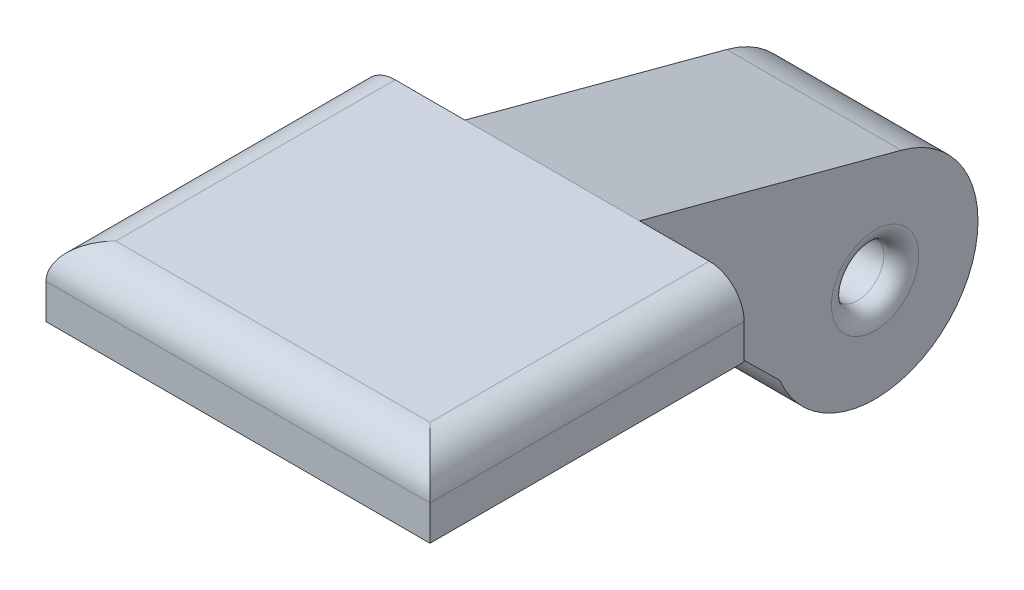
ISO-10303-21;
HEADER;
FILE_DESCRIPTION(('STEP AP214'),'2;1');
FILE_NAME('part.step','',(''),(''),'','','');
FILE_SCHEMA(('AUTOMOTIVE_DESIGN { 1 0 10303 214 1 1 1 1 }'));
ENDSEC;
DATA;
#1=APPLICATION_CONTEXT('core data for automotive mechanical design processes');
#2=APPLICATION_PROTOCOL_DEFINITION('international standard','automotive_design',2000,#1);
#3=PRODUCT_CONTEXT('',#1,'mechanical');
#4=PRODUCT('Part','Part','',(#3));
#5=PRODUCT_RELATED_PRODUCT_CATEGORY('part','',(#4));
#6=PRODUCT_DEFINITION_FORMATION('','',#4);
#7=PRODUCT_DEFINITION_CONTEXT('part definition',#1,'design');
#8=PRODUCT_DEFINITION('design','',#6,#7);
#9=PRODUCT_DEFINITION_SHAPE('','',#8);
#10=(LENGTH_UNIT() NAMED_UNIT(*) SI_UNIT(.MILLI.,.METRE.));
#11=(NAMED_UNIT(*) PLANE_ANGLE_UNIT() SI_UNIT($,.RADIAN.));
#12=(NAMED_UNIT(*) SI_UNIT($,.STERADIAN.) SOLID_ANGLE_UNIT());
#13=UNCERTAINTY_MEASURE_WITH_UNIT(LENGTH_MEASURE(1.E-05),#10,'distance_accuracy_value','');
#14=(GEOMETRIC_REPRESENTATION_CONTEXT(3) GLOBAL_UNCERTAINTY_ASSIGNED_CONTEXT((#13)) GLOBAL_UNIT_ASSIGNED_CONTEXT((#10,
#11,#12)) REPRESENTATION_CONTEXT('',''));
#15=CARTESIAN_POINT('',(0.,0.,0.));
#16=DIRECTION('',(0.,0.,1.));
#17=DIRECTION('',(1.,0.,0.));
#18=AXIS2_PLACEMENT_3D('',#15,#16,#17);
#19=CARTESIAN_POINT('',(0.,0.,0.));
#20=DIRECTION('',(0.,1.,0.));
#21=DIRECTION('',(0.,0.,1.));
#22=AXIS2_PLACEMENT_3D('',#19,#20,#21);
#23=PLANE('',#22);
#24=DIRECTION('',(-1.,0.,0.));
#25=VECTOR('',#24,1.);
#26=CARTESIAN_POINT('',(-16.4901839134658,0.,-25.5110486759406));
#27=LINE('',#26,#25);
#28=CARTESIAN_POINT('',(-13.2450919567329,0.,-25.5110486759406));
#29=VERTEX_POINT('',#28);
#30=CARTESIAN_POINT('',(-19.2450919567329,0.,-25.5110486759406));
#31=VERTEX_POINT('',#30);
#32=EDGE_CURVE('E163',#29,#31,#27,.T.);
#33=ORIENTED_EDGE('',*,*,#32,.F.);
#34=DIRECTION('',(1.,0.,0.));
#35=VECTOR('',#34,1.);
#36=CARTESIAN_POINT('',(-8.24509195673289,0.,-25.5110486759406));
#37=LINE('',#36,#35);
#38=CARTESIAN_POINT('',(-3.24509195673289,0.,-25.5110486759406));
#39=VERTEX_POINT('',#38);
#40=EDGE_CURVE('E186',#29,#39,#37,.T.);
#41=ORIENTED_EDGE('',*,*,#40,.T.);
#42=DIRECTION('',(1.,0.,0.));
#43=VECTOR('',#42,1.);
#44=CARTESIAN_POINT('',(0.,0.,-25.5110486759406));
#45=LINE('',#44,#43);
#46=CARTESIAN_POINT('',(2.7549080432671,0.,-25.5110486759406));
#47=VERTEX_POINT('',#46);
#48=EDGE_CURVE('E203',#39,#47,#45,.T.);
#49=ORIENTED_EDGE('',*,*,#48,.T.);
#50=DIRECTION('',(0.,0.,1.));
#51=VECTOR('',#50,1.);
#52=CARTESIAN_POINT('',(2.7549080432671,0.,0.));
#53=LINE('',#52,#51);
#54=CARTESIAN_POINT('',(2.7549080432671,0.,-7.51104867594061));
#55=VERTEX_POINT('',#54);
#56=EDGE_CURVE('E189',#47,#55,#53,.T.);
#57=ORIENTED_EDGE('',*,*,#56,.T.);
#58=DIRECTION('',(1.,0.,0.));
#59=VECTOR('',#58,1.);
#60=CARTESIAN_POINT('',(0.,0.,-7.51104867594061));
#61=LINE('',#60,#59);
#62=CARTESIAN_POINT('',(-19.2450919567329,0.,-7.51104867594061));
#63=VERTEX_POINT('',#62);
#64=EDGE_CURVE('E199',#63,#55,#61,.T.);
#65=ORIENTED_EDGE('',*,*,#64,.F.);
#66=DIRECTION('',(0.,0.,1.));
#67=VECTOR('',#66,1.);
#68=CARTESIAN_POINT('',(-19.2450919567329,0.,0.));
#69=LINE('',#68,#67);
#70=EDGE_CURVE('E168',#31,#63,#69,.T.);
#71=ORIENTED_EDGE('',*,*,#70,.F.);
#72=EDGE_LOOP('',(#33,#41,#49,#57,#65,#71));
#73=FACE_BOUND('',#72,.T.);
#74=ADVANCED_FACE('F41',(#73),#23,.F.);
#75=CARTESIAN_POINT('',(2.7549080432671,4.,0.));
#76=DIRECTION('',(1.,0.,0.));
#77=DIRECTION('',(0.,0.,-1.));
#78=AXIS2_PLACEMENT_3D('',#75,#76,#77);
#79=PLANE('',#78);
#80=DIRECTION('',(0.,-1.,0.));
#81=VECTOR('',#80,1.);
#82=CARTESIAN_POINT('',(2.7549080432671,4.,-25.5110486759406));
#83=LINE('',#82,#81);
#84=CARTESIAN_POINT('',(2.7549080432671,2.,-25.5110486759406));
#85=VERTEX_POINT('',#84);
#86=EDGE_CURVE('E216',#85,#47,#83,.T.);
#87=ORIENTED_EDGE('',*,*,#86,.F.);
#88=DIRECTION('',(0.,0.,1.));
#89=VECTOR('',#88,1.);
#90=CARTESIAN_POINT('',(2.7549080432671,2.,0.));
#91=LINE('',#90,#89);
#92=CARTESIAN_POINT('',(2.7549080432671,2.,-7.51104867594061));
#93=VERTEX_POINT('',#92);
#94=EDGE_CURVE('E64',#85,#93,#91,.T.);
#95=ORIENTED_EDGE('',*,*,#94,.T.);
#96=DIRECTION('',(0.,-1.,0.));
#97=VECTOR('',#96,1.);
#98=CARTESIAN_POINT('',(2.7549080432671,4.,-7.51104867594061));
#99=LINE('',#98,#97);
#100=EDGE_CURVE('E198',#93,#55,#99,.T.);
#101=ORIENTED_EDGE('',*,*,#100,.T.);
#102=ORIENTED_EDGE('',*,*,#56,.F.);
#103=EDGE_LOOP('',(#87,#95,#101,#102));
#104=FACE_BOUND('',#103,.T.);
#105=ADVANCED_FACE('F278',(#104),#79,.T.);
#106=CARTESIAN_POINT('',(0.,4.,-25.5110486759406));
#107=DIRECTION('',(0.,0.,-1.));
#108=DIRECTION('',(-1.,0.,0.));
#109=AXIS2_PLACEMENT_3D('',#106,#107,#108);
#110=PLANE('',#109);
#111=DIRECTION('',(1.,0.,0.));
#112=VECTOR('',#111,1.);
#113=CARTESIAN_POINT('',(0.,4.,-25.5110486759406));
#114=LINE('',#113,#112);
#115=CARTESIAN_POINT('',(-3.2450919567329,4.,-25.5110486759406));
#116=VERTEX_POINT('',#115);
#117=CARTESIAN_POINT('',(0.754908043267104,4.,-25.5110486759406));
#118=VERTEX_POINT('',#117);
#119=EDGE_CURVE('E141',#116,#118,#114,.T.);
#120=ORIENTED_EDGE('',*,*,#119,.T.);
#121=CARTESIAN_POINT('',(0.754908043267104,2.,-25.5110486759406));
#122=DIRECTION('',(0.,0.,-1.));
#123=DIRECTION('',(-1.,0.,0.));
#124=AXIS2_PLACEMENT_3D('',#121,#122,#123);
#125=CIRCLE('',#124,2.);
#126=EDGE_CURVE('E57',#118,#85,#125,.T.);
#127=ORIENTED_EDGE('',*,*,#126,.T.);
#128=ORIENTED_EDGE('',*,*,#86,.T.);
#129=ORIENTED_EDGE('',*,*,#48,.F.);
#130=DIRECTION('',(0.,-1.,0.));
#131=VECTOR('',#130,1.);
#132=CARTESIAN_POINT('',(-3.2450919567329,4.,-25.5110486759406));
#133=LINE('',#132,#131);
#134=EDGE_CURVE('E212',#116,#39,#133,.T.);
#135=ORIENTED_EDGE('',*,*,#134,.F.);
#136=EDGE_LOOP('',(#120,#127,#128,#129,#135));
#137=FACE_BOUND('',#136,.T.);
#138=ADVANCED_FACE('F284',(#137),#110,.T.);
#139=CARTESIAN_POINT('',(-3.24509195673289,4.,0.));
#140=DIRECTION('',(-1.,0.,0.));
#141=DIRECTION('',(0.,0.,1.));
#142=AXIS2_PLACEMENT_3D('',#139,#140,#141);
#143=PLANE('',#142);
#144=CARTESIAN_POINT('',(-3.2450919567329,-5.7,-39.0110486759406));
#145=DIRECTION('',(-1.,0.,0.));
#146=DIRECTION('',(0.,0.,1.));
#147=AXIS2_PLACEMENT_3D('',#144,#145,#146);
#148=CIRCLE('',#147,2.5);
#149=CARTESIAN_POINT('',(-3.2450919567329,-5.7,-36.5110486759406));
#150=VERTEX_POINT('',#149);
#151=EDGE_CURVE('E11',#150,#150,#148,.T.);
#152=ORIENTED_EDGE('',*,*,#151,.T.);
#153=EDGE_LOOP('',(#152));
#154=FACE_BOUND('',#153,.T.);
#155=CARTESIAN_POINT('',(-3.24509195673289,-5.7,-39.0110486759406));
#156=DIRECTION('',(1.,0.,0.));
#157=DIRECTION('',(0.,0.,-1.));
#158=AXIS2_PLACEMENT_3D('',#155,#156,#157);
#159=CIRCLE('',#158,5.89704244956011);
#160=CARTESIAN_POINT('',(-3.24509195673289,-7.9402692369487,-33.5561148176894));
#161=VERTEX_POINT('',#160);
#162=CARTESIAN_POINT('',(-3.2450919567329,0.00307896244773687,-40.5110486759406));
#163=VERTEX_POINT('',#162);
#164=EDGE_CURVE('E182',#161,#163,#159,.T.);
#165=ORIENTED_EDGE('',*,*,#164,.T.);
#166=DIRECTION('',(0.,-0.257477470325685,-0.966284301991234));
#167=VECTOR('',#166,1.);
#168=CARTESIAN_POINT('',(-3.2450919567329,0.00307896244773687,-40.5110486759406));
#169=LINE('',#168,#167);
#170=EDGE_CURVE('E131',#116,#163,#169,.T.);
#171=ORIENTED_EDGE('',*,*,#170,.F.);
#172=ORIENTED_EDGE('',*,*,#134,.T.);
#173=DIRECTION('',(0.,-0.702456024630136,-0.711727148183084));
#174=VECTOR('',#173,1.);
#175=CARTESIAN_POINT('',(-3.24509195673289,12.7544279530507,-12.5882858047544));
#176=LINE('',#175,#174);
#177=EDGE_CURVE('E178',#39,#161,#176,.T.);
#178=ORIENTED_EDGE('',*,*,#177,.T.);
#179=EDGE_LOOP('',(#165,#171,#172,#178));
#180=FACE_BOUND('',#179,.T.);
#181=ADVANCED_FACE('F292',(#154,#180),#143,.F.);
#182=CARTESIAN_POINT('',(0.,4.,-7.51104867594061));
#183=DIRECTION('',(0.,0.,-1.));
#184=DIRECTION('',(-1.,0.,0.));
#185=AXIS2_PLACEMENT_3D('',#182,#183,#184);
#186=PLANE('',#185);
#187=ORIENTED_EDGE('',*,*,#100,.F.);
#188=DIRECTION('',(1.,0.,0.));
#189=VECTOR('',#188,1.);
#190=CARTESIAN_POINT('',(-19.2450919567329,2.,-7.51104867594061));
#191=LINE('',#190,#189);
#192=CARTESIAN_POINT('',(-19.2450919567329,2.,-7.51104867594061));
#193=VERTEX_POINT('',#192);
#194=EDGE_CURVE('E233',#93,#193,#191,.F.);
#195=ORIENTED_EDGE('',*,*,#194,.T.);
#196=DIRECTION('',(0.,-1.,0.));
#197=VECTOR('',#196,1.);
#198=CARTESIAN_POINT('',(-19.2450919567329,4.,-7.51104867594061));
#199=LINE('',#198,#197);
#200=EDGE_CURVE('E155',#193,#63,#199,.T.);
#201=ORIENTED_EDGE('',*,*,#200,.T.);
#202=ORIENTED_EDGE('',*,*,#64,.T.);
#203=EDGE_LOOP('',(#187,#195,#201,#202));
#204=FACE_BOUND('',#203,.T.);
#205=ADVANCED_FACE('F289',(#204),#186,.F.);
#206=CARTESIAN_POINT('',(0.,4.,0.));
#207=DIRECTION('',(0.,1.,0.));
#208=DIRECTION('',(0.,0.,1.));
#209=AXIS2_PLACEMENT_3D('',#206,#207,#208);
#210=PLANE('',#209);
#211=DIRECTION('',(-1.,0.,0.));
#212=VECTOR('',#211,1.);
#213=CARTESIAN_POINT('',(-16.4901839134658,4.,-25.5110486759406));
#214=LINE('',#213,#212);
#215=CARTESIAN_POINT('',(-13.2450919567329,4.,-25.5110486759406));
#216=VERTEX_POINT('',#215);
#217=CARTESIAN_POINT('',(-17.2450919567329,4.,-25.5110486759406));
#218=VERTEX_POINT('',#217);
#219=EDGE_CURVE('E139',#216,#218,#214,.T.);
#220=ORIENTED_EDGE('',*,*,#219,.T.);
#221=DIRECTION('',(0.,0.,1.));
#222=VECTOR('',#221,1.);
#223=CARTESIAN_POINT('',(-17.2450919567329,4.,-7.51104867594061));
#224=LINE('',#223,#222);
#225=CARTESIAN_POINT('',(-17.2450919567329,4.,-9.51104867594061));
#226=VERTEX_POINT('',#225);
#227=EDGE_CURVE('E225',#218,#226,#224,.T.);
#228=ORIENTED_EDGE('',*,*,#227,.T.);
#229=DIRECTION('',(1.,0.,0.));
#230=VECTOR('',#229,1.);
#231=CARTESIAN_POINT('',(2.7549080432671,4.,-9.51104867594061));
#232=LINE('',#231,#230);
#233=CARTESIAN_POINT('',(0.754908043267104,4.,-9.51104867594061));
#234=VERTEX_POINT('',#233);
#235=EDGE_CURVE('E222',#226,#234,#232,.T.);
#236=ORIENTED_EDGE('',*,*,#235,.T.);
#237=DIRECTION('',(0.,0.,1.));
#238=VECTOR('',#237,1.);
#239=CARTESIAN_POINT('',(0.754908043267104,4.,0.));
#240=LINE('',#239,#238);
#241=EDGE_CURVE('E219',#234,#118,#240,.F.);
#242=ORIENTED_EDGE('',*,*,#241,.T.);
#243=ORIENTED_EDGE('',*,*,#119,.F.);
#244=DIRECTION('',(1.,0.,0.));
#245=VECTOR('',#244,1.);
#246=CARTESIAN_POINT('',(-13.2450919567329,4.,-25.5110486759406));
#247=LINE('',#246,#245);
#248=EDGE_CURVE('E122',#216,#116,#247,.T.);
#249=ORIENTED_EDGE('',*,*,#248,.F.);
#250=EDGE_LOOP('',(#220,#228,#236,#242,#243,#249));
#251=FACE_BOUND('',#250,.T.);
#252=ADVANCED_FACE('F136',(#251),#210,.T.);
#253=CARTESIAN_POINT('',(-8.24509195673289,-5.7,-39.0110486759406));
#254=DIRECTION('',(1.,0.,0.));
#255=DIRECTION('',(0.,0.,-1.));
#256=AXIS2_PLACEMENT_3D('',#253,#254,#255);
#257=CYLINDRICAL_SURFACE('',#256,5.89704244956011);
#258=ORIENTED_EDGE('',*,*,#164,.F.);
#259=DIRECTION('',(1.,0.,0.));
#260=VECTOR('',#259,1.);
#261=CARTESIAN_POINT('',(-8.24509195673289,-7.9402692369487,-33.5561148176894));
#262=LINE('',#261,#260);
#263=CARTESIAN_POINT('',(-13.2450919567329,-7.9402692369487,-33.5561148176894));
#264=VERTEX_POINT('',#263);
#265=EDGE_CURVE('E190',#264,#161,#262,.T.);
#266=ORIENTED_EDGE('',*,*,#265,.F.);
#267=CARTESIAN_POINT('',(-13.2450919567329,-5.7,-39.0110486759406));
#268=DIRECTION('',(1.,0.,0.));
#269=DIRECTION('',(0.,0.,-1.));
#270=AXIS2_PLACEMENT_3D('',#267,#268,#269);
#271=CIRCLE('',#270,5.89704244956011);
#272=CARTESIAN_POINT('',(-13.2450919567329,0.00307896244773687,-40.5110486759406));
#273=VERTEX_POINT('',#272);
#274=EDGE_CURVE('E143',#264,#273,#271,.T.);
#275=ORIENTED_EDGE('',*,*,#274,.T.);
#276=DIRECTION('',(1.,0.,0.));
#277=VECTOR('',#276,1.);
#278=CARTESIAN_POINT('',(-8.24509195673289,0.00307896244773687,-40.5110486759406));
#279=LINE('',#278,#277);
#280=EDGE_CURVE('E125',#273,#163,#279,.T.);
#281=ORIENTED_EDGE('',*,*,#280,.T.);
#282=EDGE_LOOP('',(#258,#266,#275,#281));
#283=FACE_BOUND('',#282,.T.);
#284=ADVANCED_FACE('F334',(#283),#257,.T.);
#285=CARTESIAN_POINT('',(-8.24509195673289,12.7544279530507,-12.5882858047544));
#286=DIRECTION('',(0.,-0.711727148183084,0.702456024630136));
#287=DIRECTION('',(0.,-0.702456024630136,-0.711727148183084));
#288=AXIS2_PLACEMENT_3D('',#285,#286,#287);
#289=PLANE('',#288);
#290=ORIENTED_EDGE('',*,*,#177,.F.);
#291=ORIENTED_EDGE('',*,*,#40,.F.);
#292=DIRECTION('',(0.,-0.702456024630136,-0.711727148183084));
#293=VECTOR('',#292,1.);
#294=CARTESIAN_POINT('',(-13.2450919567329,12.7544279530507,-12.5882858047544));
#295=LINE('',#294,#293);
#296=EDGE_CURVE('E150',#29,#264,#295,.T.);
#297=ORIENTED_EDGE('',*,*,#296,.T.);
#298=ORIENTED_EDGE('',*,*,#265,.T.);
#299=EDGE_LOOP('',(#290,#291,#297,#298));
#300=FACE_BOUND('',#299,.T.);
#301=ADVANCED_FACE('F332',(#300),#289,.T.);
#302=CARTESIAN_POINT('',(-8.24509195673289,-5.7,-39.0110486759406));
#303=DIRECTION('',(1.,0.,0.));
#304=DIRECTION('',(0.,0.,-1.));
#305=AXIS2_PLACEMENT_3D('',#302,#303,#304);
#306=CYLINDRICAL_SURFACE('',#305,1.5);
#307=CARTESIAN_POINT('',(-12.2450919567329,-5.7,-39.0110486759406));
#308=DIRECTION('',(-1.,0.,0.));
#309=DIRECTION('',(0.,0.,1.));
#310=AXIS2_PLACEMENT_3D('',#307,#308,#309);
#311=CIRCLE('',#310,1.5);
#312=CARTESIAN_POINT('',(-12.2450919567329,-5.7,-37.5110486759406));
#313=VERTEX_POINT('',#312);
#314=EDGE_CURVE('E50',#313,#313,#311,.T.);
#315=ORIENTED_EDGE('',*,*,#314,.T.);
#316=EDGE_LOOP('',(#315));
#317=FACE_BOUND('',#316,.T.);
#318=CARTESIAN_POINT('',(-4.2450919567329,-5.7,-39.0110486759406));
#319=DIRECTION('',(-1.,0.,0.));
#320=DIRECTION('',(0.,0.,1.));
#321=AXIS2_PLACEMENT_3D('',#318,#319,#320);
#322=CIRCLE('',#321,1.5);
#323=CARTESIAN_POINT('',(-4.2450919567329,-5.7,-37.5110486759406));
#324=VERTEX_POINT('',#323);
#325=EDGE_CURVE('E251',#324,#324,#322,.F.);
#326=ORIENTED_EDGE('',*,*,#325,.T.);
#327=EDGE_LOOP('',(#326));
#328=FACE_BOUND('',#327,.T.);
#329=ADVANCED_FACE('F258',(#317,#328),#306,.F.);
#330=CARTESIAN_POINT('',(-19.2450919567329,4.,0.));
#331=DIRECTION('',(1.,0.,0.));
#332=DIRECTION('',(0.,0.,-1.));
#333=AXIS2_PLACEMENT_3D('',#330,#331,#332);
#334=PLANE('',#333);
#335=ORIENTED_EDGE('',*,*,#200,.F.);
#336=DIRECTION('',(0.,0.,1.));
#337=VECTOR('',#336,1.);
#338=CARTESIAN_POINT('',(-19.2450919567329,2.,-25.5110486759406));
#339=LINE('',#338,#337);
#340=CARTESIAN_POINT('',(-19.2450919567329,2.,-25.5110486759406));
#341=VERTEX_POINT('',#340);
#342=EDGE_CURVE('E228',#193,#341,#339,.F.);
#343=ORIENTED_EDGE('',*,*,#342,.T.);
#344=DIRECTION('',(0.,-1.,0.));
#345=VECTOR('',#344,1.);
#346=CARTESIAN_POINT('',(-19.2450919567329,4.,-25.5110486759406));
#347=LINE('',#346,#345);
#348=EDGE_CURVE('E156',#341,#31,#347,.T.);
#349=ORIENTED_EDGE('',*,*,#348,.T.);
#350=ORIENTED_EDGE('',*,*,#70,.T.);
#351=EDGE_LOOP('',(#335,#343,#349,#350));
#352=FACE_BOUND('',#351,.T.);
#353=ADVANCED_FACE('F268',(#352),#334,.F.);
#354=CARTESIAN_POINT('',(-13.2450919567329,4.,0.));
#355=DIRECTION('',(-1.,0.,0.));
#356=DIRECTION('',(0.,0.,1.));
#357=AXIS2_PLACEMENT_3D('',#354,#355,#356);
#358=PLANE('',#357);
#359=CARTESIAN_POINT('',(-13.2450919567329,-5.7,-39.0110486759406));
#360=DIRECTION('',(-1.,0.,0.));
#361=DIRECTION('',(0.,0.,1.));
#362=AXIS2_PLACEMENT_3D('',#359,#360,#361);
#363=CIRCLE('',#362,2.5);
#364=CARTESIAN_POINT('',(-13.2450919567329,-5.7,-36.5110486759406));
#365=VERTEX_POINT('',#364);
#366=EDGE_CURVE('E240',#365,#365,#363,.F.);
#367=ORIENTED_EDGE('',*,*,#366,.T.);
#368=EDGE_LOOP('',(#367));
#369=FACE_BOUND('',#368,.T.);
#370=DIRECTION('',(0.,-0.257477470325685,-0.966284301991234));
#371=VECTOR('',#370,1.);
#372=CARTESIAN_POINT('',(-13.2450919567329,0.00307896244773687,-40.5110486759406));
#373=LINE('',#372,#371);
#374=EDGE_CURVE('E119',#216,#273,#373,.T.);
#375=ORIENTED_EDGE('',*,*,#374,.T.);
#376=ORIENTED_EDGE('',*,*,#274,.F.);
#377=ORIENTED_EDGE('',*,*,#296,.F.);
#378=DIRECTION('',(0.,-1.,0.));
#379=VECTOR('',#378,1.);
#380=CARTESIAN_POINT('',(-13.2450919567329,4.,-25.5110486759406));
#381=LINE('',#380,#379);
#382=EDGE_CURVE('E147',#216,#29,#381,.T.);
#383=ORIENTED_EDGE('',*,*,#382,.F.);
#384=EDGE_LOOP('',(#375,#376,#377,#383));
#385=FACE_BOUND('',#384,.T.);
#386=ADVANCED_FACE('F148',(#369,#385),#358,.T.);
#387=CARTESIAN_POINT('',(-16.4901839134658,4.,-25.5110486759406));
#388=DIRECTION('',(0.,0.,1.));
#389=DIRECTION('',(1.,0.,0.));
#390=AXIS2_PLACEMENT_3D('',#387,#388,#389);
#391=PLANE('',#390);
#392=ORIENTED_EDGE('',*,*,#348,.F.);
#393=CARTESIAN_POINT('',(-17.2450919567329,2.,-25.5110486759406));
#394=DIRECTION('',(0.,0.,1.));
#395=DIRECTION('',(1.,0.,0.));
#396=AXIS2_PLACEMENT_3D('',#393,#394,#395);
#397=CIRCLE('',#396,2.);
#398=EDGE_CURVE('E161',#341,#218,#397,.F.);
#399=ORIENTED_EDGE('',*,*,#398,.T.);
#400=ORIENTED_EDGE('',*,*,#219,.F.);
#401=ORIENTED_EDGE('',*,*,#382,.T.);
#402=ORIENTED_EDGE('',*,*,#32,.T.);
#403=EDGE_LOOP('',(#392,#399,#400,#401,#402));
#404=FACE_BOUND('',#403,.T.);
#405=ADVANCED_FACE('F159',(#404),#391,.F.);
#406=CARTESIAN_POINT('',(-13.2450919567329,0.00307896244773687,-40.5110486759406));
#407=DIRECTION('',(0.,-0.966284301991234,0.257477470325685));
#408=DIRECTION('',(0.,-0.257477470325685,-0.966284301991234));
#409=AXIS2_PLACEMENT_3D('',#406,#407,#408);
#410=PLANE('',#409);
#411=ORIENTED_EDGE('',*,*,#170,.T.);
#412=ORIENTED_EDGE('',*,*,#280,.F.);
#413=ORIENTED_EDGE('',*,*,#374,.F.);
#414=ORIENTED_EDGE('',*,*,#248,.T.);
#415=EDGE_LOOP('',(#411,#412,#413,#414));
#416=FACE_BOUND('',#415,.T.);
#417=ADVANCED_FACE('F121',(#416),#410,.F.);
#418=CARTESIAN_POINT('',(0.754908043267104,2.,0.));
#419=DIRECTION('',(0.,0.,1.));
#420=DIRECTION('',(1.,0.,0.));
#421=AXIS2_PLACEMENT_3D('',#418,#419,#420);
#422=CYLINDRICAL_SURFACE('',#421,2.);
#423=ORIENTED_EDGE('',*,*,#126,.F.);
#424=ORIENTED_EDGE('',*,*,#241,.F.);
#425=CARTESIAN_POINT('',(0.754908043267104,2.,-9.51104867594061));
#426=DIRECTION('',(-0.707106781186547,0.,0.707106781186547));
#427=DIRECTION('',(0.707106781186547,0.,0.707106781186547));
#428=AXIS2_PLACEMENT_3D('',#425,#426,#427);
#429=ELLIPSE('',#428,2.82842712474619,2.);
#430=EDGE_CURVE('E244',#93,#234,#429,.T.);
#431=ORIENTED_EDGE('',*,*,#430,.F.);
#432=ORIENTED_EDGE('',*,*,#94,.F.);
#433=EDGE_LOOP('',(#423,#424,#431,#432));
#434=FACE_BOUND('',#433,.T.);
#435=ADVANCED_FACE('F305',(#434),#422,.T.);
#436=CARTESIAN_POINT('',(0.,2.,-9.51104867594061));
#437=DIRECTION('',(-1.,0.,0.));
#438=DIRECTION('',(0.,0.,1.));
#439=AXIS2_PLACEMENT_3D('',#436,#437,#438);
#440=CYLINDRICAL_SURFACE('',#439,2.);
#441=ORIENTED_EDGE('',*,*,#430,.T.);
#442=ORIENTED_EDGE('',*,*,#235,.F.);
#443=CARTESIAN_POINT('',(-17.2450919567329,2.,-9.51104867594061));
#444=DIRECTION('',(-0.707106781186548,0.,-0.707106781186547));
#445=DIRECTION('',(-0.707106781186547,0.,0.707106781186548));
#446=AXIS2_PLACEMENT_3D('',#443,#444,#445);
#447=ELLIPSE('',#446,2.82842712474619,2.);
#448=EDGE_CURVE('E241',#193,#226,#447,.T.);
#449=ORIENTED_EDGE('',*,*,#448,.F.);
#450=ORIENTED_EDGE('',*,*,#194,.F.);
#451=EDGE_LOOP('',(#441,#442,#449,#450));
#452=FACE_BOUND('',#451,.T.);
#453=ADVANCED_FACE('F301',(#452),#440,.T.);
#454=CARTESIAN_POINT('',(-17.2450919567329,2.,0.));
#455=DIRECTION('',(0.,0.,-1.));
#456=DIRECTION('',(-1.,0.,0.));
#457=AXIS2_PLACEMENT_3D('',#454,#455,#456);
#458=CYLINDRICAL_SURFACE('',#457,2.);
#459=ORIENTED_EDGE('',*,*,#398,.F.);
#460=ORIENTED_EDGE('',*,*,#342,.F.);
#461=ORIENTED_EDGE('',*,*,#448,.T.);
#462=ORIENTED_EDGE('',*,*,#227,.F.);
#463=EDGE_LOOP('',(#459,#460,#461,#462));
#464=FACE_BOUND('',#463,.T.);
#465=ADVANCED_FACE('F264',(#464),#458,.T.);
#466=CARTESIAN_POINT('',(-12.2450919567329,-5.7,-39.0110486759406));
#467=DIRECTION('',(-1.,0.,0.));
#468=DIRECTION('',(0.,0.,1.));
#469=AXIS2_PLACEMENT_3D('',#466,#467,#468);
#470=TOROIDAL_SURFACE('',#469,2.5,1.);
#471=ORIENTED_EDGE('',*,*,#314,.F.);
#472=EDGE_LOOP('',(#471));
#473=FACE_BOUND('',#472,.T.);
#474=ORIENTED_EDGE('',*,*,#366,.F.);
#475=EDGE_LOOP('',(#474));
#476=FACE_BOUND('',#475,.T.);
#477=ADVANCED_FACE('F261',(#473,#476),#470,.T.);
#478=CARTESIAN_POINT('',(-4.2450919567329,-5.7,-39.0110486759406));
#479=DIRECTION('',(-1.,0.,0.));
#480=DIRECTION('',(0.,0.,1.));
#481=AXIS2_PLACEMENT_3D('',#478,#479,#480);
#482=TOROIDAL_SURFACE('',#481,2.5,1.);
#483=ORIENTED_EDGE('',*,*,#151,.F.);
#484=EDGE_LOOP('',(#483));
#485=FACE_BOUND('',#484,.T.);
#486=ORIENTED_EDGE('',*,*,#325,.F.);
#487=EDGE_LOOP('',(#486));
#488=FACE_BOUND('',#487,.T.);
#489=ADVANCED_FACE('F43',(#485,#488),#482,.T.);
#490=CLOSED_SHELL('',(#74,#105,#138,#181,#205,#252,#284,#301,#329,#353,#386,#405,#417,#435,#453,
#465,#477,#489));
#491=MANIFOLD_SOLID_BREP('B2',#490);
#492=ADVANCED_BREP_SHAPE_REPRESENTATION('',(#18,#491),#14);
#493=SHAPE_DEFINITION_REPRESENTATION(#9,#492);
ENDSEC;
END-ISO-10303-21;
